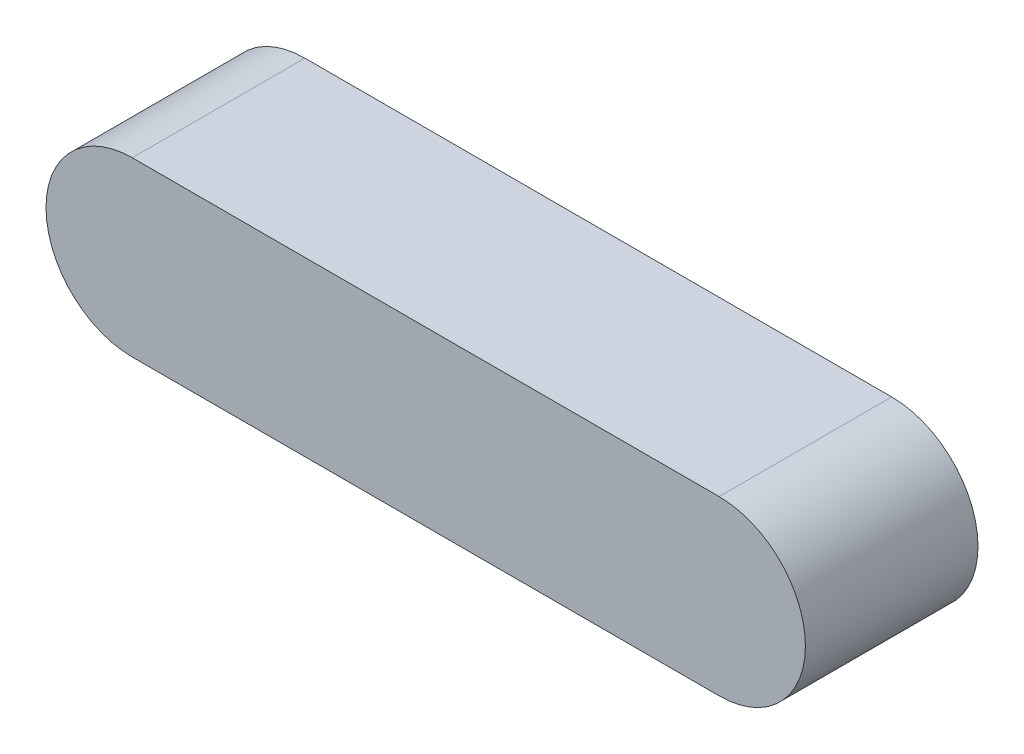
ISO-10303-21;
HEADER;
FILE_DESCRIPTION(('STEP AP214'),'2;1');
FILE_NAME('part.step','',(''),(''),'','','');
FILE_SCHEMA(('AUTOMOTIVE_DESIGN { 1 0 10303 214 1 1 1 1 }'));
ENDSEC;
DATA;
#1=APPLICATION_CONTEXT('core data for automotive mechanical design processes');
#2=APPLICATION_PROTOCOL_DEFINITION('international standard','automotive_design',2000,#1);
#3=PRODUCT_CONTEXT('',#1,'mechanical');
#4=PRODUCT('Part','Part','',(#3));
#5=PRODUCT_RELATED_PRODUCT_CATEGORY('part','',(#4));
#6=PRODUCT_DEFINITION_FORMATION('','',#4);
#7=PRODUCT_DEFINITION_CONTEXT('part definition',#1,'design');
#8=PRODUCT_DEFINITION('design','',#6,#7);
#9=PRODUCT_DEFINITION_SHAPE('','',#8);
#10=(LENGTH_UNIT() NAMED_UNIT(*) SI_UNIT(.MILLI.,.METRE.));
#11=(NAMED_UNIT(*) PLANE_ANGLE_UNIT() SI_UNIT($,.RADIAN.));
#12=(NAMED_UNIT(*) SI_UNIT($,.STERADIAN.) SOLID_ANGLE_UNIT());
#13=UNCERTAINTY_MEASURE_WITH_UNIT(LENGTH_MEASURE(1.E-05),#10,'distance_accuracy_value','');
#14=(GEOMETRIC_REPRESENTATION_CONTEXT(3) GLOBAL_UNCERTAINTY_ASSIGNED_CONTEXT((#13)) GLOBAL_UNIT_ASSIGNED_CONTEXT((#10,
#11,#12)) REPRESENTATION_CONTEXT('',''));
#15=CARTESIAN_POINT('',(0.,0.,0.));
#16=DIRECTION('',(0.,0.,1.));
#17=DIRECTION('',(1.,0.,0.));
#18=AXIS2_PLACEMENT_3D('',#15,#16,#17);
#19=CARTESIAN_POINT('',(16.56,18.492,6.));
#20=DIRECTION('',(0.,0.,-1.));
#21=DIRECTION('',(1.,0.,0.));
#22=AXIS2_PLACEMENT_3D('',#19,#20,#21);
#23=PLANE('',#22);
#24=CARTESIAN_POINT('',(36.5,15.892,6.00000000000016));
#25=DIRECTION('',(0.,0.,-1.));
#26=DIRECTION('',(-1.,0.,0.));
#27=AXIS2_PLACEMENT_3D('',#24,#25,#26);
#28=CIRCLE('',#27,2.5);
#29=CARTESIAN_POINT('',(36.5,18.392,6.00000000000008));
#30=VERTEX_POINT('',#29);
#31=CARTESIAN_POINT('',(36.5,13.392,6.00000000000008));
#32=VERTEX_POINT('',#31);
#33=EDGE_CURVE('E67',#30,#32,#28,.T.);
#34=ORIENTED_EDGE('',*,*,#33,.T.);
#35=DIRECTION('',(1.,0.,0.));
#36=VECTOR('',#35,1.);
#37=CARTESIAN_POINT('',(28.,13.392,6.));
#38=LINE('',#37,#36);
#39=CARTESIAN_POINT('',(19.5,13.392,6.00000000000008));
#40=VERTEX_POINT('',#39);
#41=EDGE_CURVE('E65',#40,#32,#38,.T.);
#42=ORIENTED_EDGE('',*,*,#41,.F.);
#43=CARTESIAN_POINT('',(19.5,15.892,6.00000000000016));
#44=DIRECTION('',(0.,0.,-1.));
#45=DIRECTION('',(-1.,0.,0.));
#46=AXIS2_PLACEMENT_3D('',#43,#44,#45);
#47=CIRCLE('',#46,2.5);
#48=CARTESIAN_POINT('',(19.5,18.392,6.00000000000008));
#49=VERTEX_POINT('',#48);
#50=EDGE_CURVE('E21',#40,#49,#47,.T.);
#51=ORIENTED_EDGE('',*,*,#50,.T.);
#52=DIRECTION('',(-1.,0.,0.));
#53=VECTOR('',#52,1.);
#54=CARTESIAN_POINT('',(28.,18.392,6.));
#55=LINE('',#54,#53);
#56=EDGE_CURVE('E63',#30,#49,#55,.T.);
#57=ORIENTED_EDGE('',*,*,#56,.F.);
#58=EDGE_LOOP('',(#34,#42,#51,#57));
#59=FACE_BOUND('',#58,.T.);
#60=ADVANCED_FACE('F17',(#59),#23,.T.);
#61=CARTESIAN_POINT('',(19.5,15.892,11.));
#62=DIRECTION('',(0.,0.,-1.));
#63=DIRECTION('',(-1.,0.,0.));
#64=AXIS2_PLACEMENT_3D('',#61,#62,#63);
#65=CYLINDRICAL_SURFACE('',#64,2.5);
#66=ORIENTED_EDGE('',*,*,#50,.F.);
#67=DIRECTION('',(0.,0.,-1.));
#68=VECTOR('',#67,1.);
#69=CARTESIAN_POINT('',(19.5,13.392,8.5));
#70=LINE('',#69,#68);
#71=CARTESIAN_POINT('',(19.5,13.392,11.));
#72=VERTEX_POINT('',#71);
#73=EDGE_CURVE('E59',#72,#40,#70,.T.);
#74=ORIENTED_EDGE('',*,*,#73,.F.);
#75=CARTESIAN_POINT('',(19.5,15.892,11.));
#76=DIRECTION('',(0.,0.,-1.));
#77=DIRECTION('',(-1.,0.,0.));
#78=AXIS2_PLACEMENT_3D('',#75,#76,#77);
#79=CIRCLE('',#78,2.5);
#80=CARTESIAN_POINT('',(19.5,18.392,11.));
#81=VERTEX_POINT('',#80);
#82=EDGE_CURVE('E71',#72,#81,#79,.T.);
#83=ORIENTED_EDGE('',*,*,#82,.T.);
#84=DIRECTION('',(0.,0.,1.));
#85=VECTOR('',#84,1.);
#86=CARTESIAN_POINT('',(19.5,18.392,8.5));
#87=LINE('',#86,#85);
#88=EDGE_CURVE('E60',#49,#81,#87,.T.);
#89=ORIENTED_EDGE('',*,*,#88,.F.);
#90=EDGE_LOOP('',(#66,#74,#83,#89));
#91=FACE_BOUND('',#90,.T.);
#92=ADVANCED_FACE('F57',(#91),#65,.T.);
#93=CARTESIAN_POINT('',(19.16,18.392,11.1));
#94=DIRECTION('',(0.,1.,0.));
#95=DIRECTION('',(1.,0.,0.));
#96=AXIS2_PLACEMENT_3D('',#93,#94,#95);
#97=PLANE('',#96);
#98=ORIENTED_EDGE('',*,*,#56,.T.);
#99=ORIENTED_EDGE('',*,*,#88,.T.);
#100=DIRECTION('',(1.,0.,0.));
#101=VECTOR('',#100,1.);
#102=CARTESIAN_POINT('',(28.,18.392,11.));
#103=LINE('',#102,#101);
#104=CARTESIAN_POINT('',(36.5,18.392,11.));
#105=VERTEX_POINT('',#104);
#106=EDGE_CURVE('E80',#81,#105,#103,.T.);
#107=ORIENTED_EDGE('',*,*,#106,.T.);
#108=DIRECTION('',(0.,0.,-1.));
#109=VECTOR('',#108,1.);
#110=CARTESIAN_POINT('',(36.5000000000008,18.392,8.5));
#111=LINE('',#110,#109);
#112=EDGE_CURVE('E81',#105,#30,#111,.T.);
#113=ORIENTED_EDGE('',*,*,#112,.T.);
#114=EDGE_LOOP('',(#98,#99,#107,#113));
#115=FACE_BOUND('',#114,.T.);
#116=ADVANCED_FACE('F87',(#115),#97,.T.);
#117=CARTESIAN_POINT('',(36.5,15.892,11.));
#118=DIRECTION('',(0.,0.,-1.));
#119=DIRECTION('',(-1.,0.,0.));
#120=AXIS2_PLACEMENT_3D('',#117,#118,#119);
#121=CYLINDRICAL_SURFACE('',#120,2.5);
#122=ORIENTED_EDGE('',*,*,#33,.F.);
#123=ORIENTED_EDGE('',*,*,#112,.F.);
#124=CARTESIAN_POINT('',(36.5,15.892,11.));
#125=DIRECTION('',(0.,0.,-1.));
#126=DIRECTION('',(-1.,0.,0.));
#127=AXIS2_PLACEMENT_3D('',#124,#125,#126);
#128=CIRCLE('',#127,2.5);
#129=CARTESIAN_POINT('',(36.5,13.392,11.));
#130=VERTEX_POINT('',#129);
#131=EDGE_CURVE('E27',#105,#130,#128,.T.);
#132=ORIENTED_EDGE('',*,*,#131,.T.);
#133=DIRECTION('',(0.,0.,1.));
#134=VECTOR('',#133,1.);
#135=CARTESIAN_POINT('',(36.5,13.392,8.5));
#136=LINE('',#135,#134);
#137=EDGE_CURVE('E35',#32,#130,#136,.T.);
#138=ORIENTED_EDGE('',*,*,#137,.F.);
#139=EDGE_LOOP('',(#122,#123,#132,#138));
#140=FACE_BOUND('',#139,.T.);
#141=ADVANCED_FACE('F91',(#140),#121,.T.);
#142=CARTESIAN_POINT('',(36.84,13.392,11.1));
#143=DIRECTION('',(0.,-1.,0.));
#144=DIRECTION('',(-1.,0.,0.));
#145=AXIS2_PLACEMENT_3D('',#142,#143,#144);
#146=PLANE('',#145);
#147=ORIENTED_EDGE('',*,*,#41,.T.);
#148=ORIENTED_EDGE('',*,*,#137,.T.);
#149=DIRECTION('',(-1.,0.,0.));
#150=VECTOR('',#149,1.);
#151=CARTESIAN_POINT('',(28.,13.392,11.));
#152=LINE('',#151,#150);
#153=EDGE_CURVE('E11',#130,#72,#152,.T.);
#154=ORIENTED_EDGE('',*,*,#153,.T.);
#155=ORIENTED_EDGE('',*,*,#73,.T.);
#156=EDGE_LOOP('',(#147,#148,#154,#155));
#157=FACE_BOUND('',#156,.T.);
#158=ADVANCED_FACE('F64',(#157),#146,.T.);
#159=CARTESIAN_POINT('',(16.56,18.492,11.));
#160=DIRECTION('',(0.,0.,-1.));
#161=DIRECTION('',(1.,0.,0.));
#162=AXIS2_PLACEMENT_3D('',#159,#160,#161);
#163=PLANE('',#162);
#164=ORIENTED_EDGE('',*,*,#131,.F.);
#165=ORIENTED_EDGE('',*,*,#106,.F.);
#166=ORIENTED_EDGE('',*,*,#82,.F.);
#167=ORIENTED_EDGE('',*,*,#153,.F.);
#168=EDGE_LOOP('',(#164,#165,#166,#167));
#169=FACE_BOUND('',#168,.T.);
#170=ADVANCED_FACE('F19',(#169),#163,.F.);
#171=CLOSED_SHELL('',(#60,#92,#116,#141,#158,#170));
#172=MANIFOLD_SOLID_BREP('B1',#171);
#173=ADVANCED_BREP_SHAPE_REPRESENTATION('',(#18,#172),#14);
#174=SHAPE_DEFINITION_REPRESENTATION(#9,#173);
ENDSEC;
END-ISO-10303-21;
